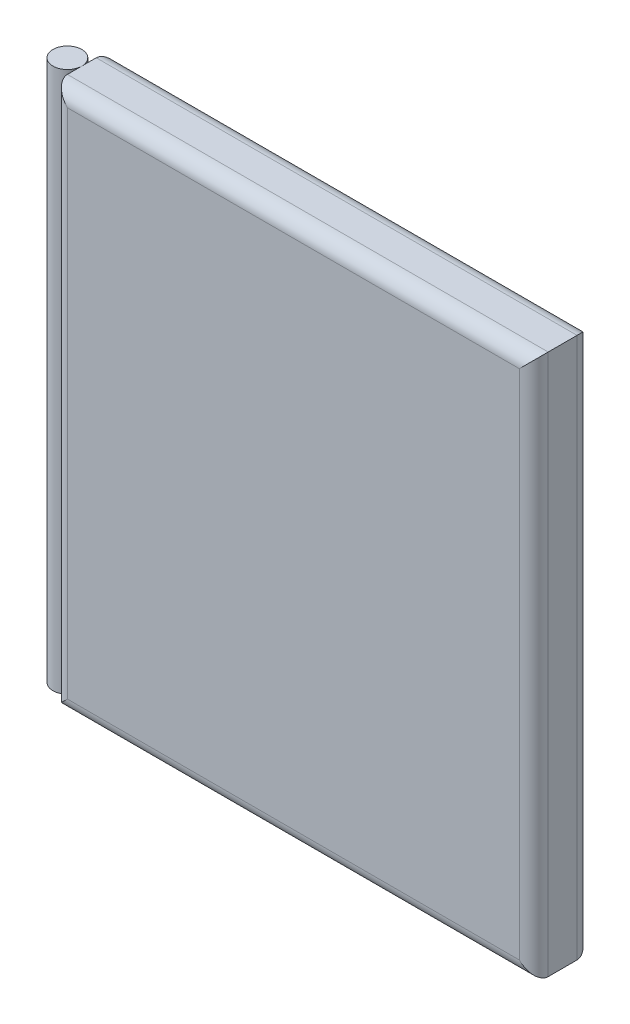
ISO-10303-21;
HEADER;
FILE_DESCRIPTION(('STEP AP214'),'2;1');
FILE_NAME('part.step','',(''),(''),'','','');
FILE_SCHEMA(('AUTOMOTIVE_DESIGN { 1 0 10303 214 1 1 1 1 }'));
ENDSEC;
DATA;
#1=APPLICATION_CONTEXT('core data for automotive mechanical design processes');
#2=APPLICATION_PROTOCOL_DEFINITION('international standard','automotive_design',2000,#1);
#3=PRODUCT_CONTEXT('',#1,'mechanical');
#4=PRODUCT('Part','Part','',(#3));
#5=PRODUCT_RELATED_PRODUCT_CATEGORY('part','',(#4));
#6=PRODUCT_DEFINITION_FORMATION('','',#4);
#7=PRODUCT_DEFINITION_CONTEXT('part definition',#1,'design');
#8=PRODUCT_DEFINITION('design','',#6,#7);
#9=PRODUCT_DEFINITION_SHAPE('','',#8);
#10=(LENGTH_UNIT() NAMED_UNIT(*) SI_UNIT(.MILLI.,.METRE.));
#11=(NAMED_UNIT(*) PLANE_ANGLE_UNIT() SI_UNIT($,.RADIAN.));
#12=(NAMED_UNIT(*) SI_UNIT($,.STERADIAN.) SOLID_ANGLE_UNIT());
#13=UNCERTAINTY_MEASURE_WITH_UNIT(LENGTH_MEASURE(1.E-05),#10,'distance_accuracy_value','');
#14=(GEOMETRIC_REPRESENTATION_CONTEXT(3) GLOBAL_UNCERTAINTY_ASSIGNED_CONTEXT((#13)) GLOBAL_UNIT_ASSIGNED_CONTEXT((#10,
#11,#12)) REPRESENTATION_CONTEXT('',''));
#15=CARTESIAN_POINT('',(0.,0.,0.));
#16=DIRECTION('',(0.,0.,1.));
#17=DIRECTION('',(1.,0.,0.));
#18=AXIS2_PLACEMENT_3D('',#15,#16,#17);
#19=CARTESIAN_POINT('',(-275.994676806084,131.165589353612,40.));
#20=DIRECTION('',(0.,-1.,0.));
#21=DIRECTION('',(0.,0.,-1.));
#22=AXIS2_PLACEMENT_3D('',#19,#20,#21);
#23=CYLINDRICAL_SURFACE('',#22,20.);
#24=CARTESIAN_POINT('',(-275.994676806084,131.165589353612,40.));
#25=DIRECTION('',(0.,-1.,0.));
#26=DIRECTION('',(0.,0.,-1.));
#27=AXIS2_PLACEMENT_3D('',#24,#25,#26);
#28=CIRCLE('',#27,20.);
#29=CARTESIAN_POINT('',(-275.994676806084,131.165589353612,20.));
#30=VERTEX_POINT('',#29);
#31=EDGE_CURVE('E11',#30,#30,#28,.T.);
#32=CARTESIAN_POINT('',(-275.994676806084,-618.834410646388,40.));
#33=DIRECTION('',(0.,-1.,0.));
#34=DIRECTION('',(0.,0.,-1.));
#35=AXIS2_PLACEMENT_3D('',#32,#33,#34);
#36=CIRCLE('',#35,20.);
#37=CARTESIAN_POINT('',(-275.994676806084,-618.834410646388,20.));
#38=VERTEX_POINT('',#37);
#39=EDGE_CURVE('E50',#38,#38,#36,.T.);
#40=CARTESIAN_POINT('',(-275.994676806084,131.165589353612,20.));
#41=CARTESIAN_POINT('',(-275.994676806084,123.353089353612,20.));
#42=CARTESIAN_POINT('',(-275.994676806084,115.540589353612,20.));
#43=CARTESIAN_POINT('',(-275.994676806084,99.9155893536122,20.));
#44=CARTESIAN_POINT('',(-275.994676806084,92.1030893536122,20.));
#45=CARTESIAN_POINT('',(-275.994676806084,76.4780893536122,20.));
#46=CARTESIAN_POINT('',(-275.994676806084,68.6655893536122,20.));
#47=CARTESIAN_POINT('',(-275.994676806084,53.0405893536122,20.));
#48=CARTESIAN_POINT('',(-275.994676806084,45.2280893536122,20.));
#49=CARTESIAN_POINT('',(-275.994676806084,29.6030893536122,20.));
#50=CARTESIAN_POINT('',(-275.994676806084,21.7905893536122,20.));
#51=CARTESIAN_POINT('',(-275.994676806084,6.16558935361222,20.));
#52=CARTESIAN_POINT('',(-275.994676806084,-1.64691064638778,20.));
#53=CARTESIAN_POINT('',(-275.994676806084,-17.2719106463878,20.));
#54=CARTESIAN_POINT('',(-275.994676806084,-25.0844106463878,20.));
#55=CARTESIAN_POINT('',(-275.994676806084,-40.7094106463878,20.));
#56=CARTESIAN_POINT('',(-275.994676806084,-48.5219106463878,20.));
#57=CARTESIAN_POINT('',(-275.994676806084,-64.1469106463878,20.));
#58=CARTESIAN_POINT('',(-275.994676806084,-71.9594106463878,20.));
#59=CARTESIAN_POINT('',(-275.994676806084,-87.5844106463878,20.));
#60=CARTESIAN_POINT('',(-275.994676806084,-95.3969106463878,20.));
#61=CARTESIAN_POINT('',(-275.994676806084,-111.021910646388,20.));
#62=CARTESIAN_POINT('',(-275.994676806084,-118.834410646388,20.));
#63=CARTESIAN_POINT('',(-275.994676806084,-134.459410646388,20.));
#64=CARTESIAN_POINT('',(-275.994676806084,-142.271910646388,20.));
#65=CARTESIAN_POINT('',(-275.994676806084,-157.896910646388,20.));
#66=CARTESIAN_POINT('',(-275.994676806084,-165.709410646388,20.));
#67=CARTESIAN_POINT('',(-275.994676806084,-181.334410646388,20.));
#68=CARTESIAN_POINT('',(-275.994676806084,-189.146910646388,20.));
#69=CARTESIAN_POINT('',(-275.994676806084,-204.771910646388,20.));
#70=CARTESIAN_POINT('',(-275.994676806084,-212.584410646388,20.));
#71=CARTESIAN_POINT('',(-275.994676806084,-228.209410646388,20.));
#72=CARTESIAN_POINT('',(-275.994676806084,-236.021910646388,20.));
#73=CARTESIAN_POINT('',(-275.994676806084,-251.646910646388,20.));
#74=CARTESIAN_POINT('',(-275.994676806084,-259.459410646388,20.));
#75=CARTESIAN_POINT('',(-275.994676806084,-275.084410646388,20.));
#76=CARTESIAN_POINT('',(-275.994676806084,-282.896910646388,20.));
#77=CARTESIAN_POINT('',(-275.994676806084,-298.521910646388,20.));
#78=CARTESIAN_POINT('',(-275.994676806084,-306.334410646388,20.));
#79=CARTESIAN_POINT('',(-275.994676806084,-321.959410646388,20.));
#80=CARTESIAN_POINT('',(-275.994676806084,-329.771910646388,20.));
#81=CARTESIAN_POINT('',(-275.994676806084,-345.396910646388,20.));
#82=CARTESIAN_POINT('',(-275.994676806084,-353.209410646388,20.));
#83=CARTESIAN_POINT('',(-275.994676806084,-368.834410646388,20.));
#84=CARTESIAN_POINT('',(-275.994676806084,-376.646910646388,20.));
#85=CARTESIAN_POINT('',(-275.994676806084,-392.271910646388,20.));
#86=CARTESIAN_POINT('',(-275.994676806084,-400.084410646388,20.));
#87=CARTESIAN_POINT('',(-275.994676806084,-415.709410646388,20.));
#88=CARTESIAN_POINT('',(-275.994676806084,-423.521910646388,20.));
#89=CARTESIAN_POINT('',(-275.994676806084,-439.146910646388,20.));
#90=CARTESIAN_POINT('',(-275.994676806084,-446.959410646388,20.));
#91=CARTESIAN_POINT('',(-275.994676806084,-462.584410646388,20.));
#92=CARTESIAN_POINT('',(-275.994676806084,-470.396910646388,20.));
#93=CARTESIAN_POINT('',(-275.994676806084,-486.021910646388,20.));
#94=CARTESIAN_POINT('',(-275.994676806084,-493.834410646388,20.));
#95=CARTESIAN_POINT('',(-275.994676806084,-509.459410646388,20.));
#96=CARTESIAN_POINT('',(-275.994676806084,-517.271910646388,20.));
#97=CARTESIAN_POINT('',(-275.994676806084,-532.896910646388,20.));
#98=CARTESIAN_POINT('',(-275.994676806084,-540.709410646388,20.));
#99=CARTESIAN_POINT('',(-275.994676806084,-556.334410646388,20.));
#100=CARTESIAN_POINT('',(-275.994676806084,-564.146910646388,20.));
#101=CARTESIAN_POINT('',(-275.994676806084,-579.771910646388,20.));
#102=CARTESIAN_POINT('',(-275.994676806084,-587.584410646388,20.));
#103=CARTESIAN_POINT('',(-275.994676806084,-603.209410646388,20.));
#104=CARTESIAN_POINT('',(-275.994676806084,-611.021910646388,20.));
#105=CARTESIAN_POINT('',(-275.994676806084,-618.834410646388,20.));
#106=B_SPLINE_CURVE_WITH_KNOTS('',3,(#40,#41,#42,#43,#44,#45,#46,#47,#48,#49,#50,#51,#52,#53,
#54,#55,#56,#57,#58,#59,#60,#61,#62,#63,#64,#65,#66,#67,#68,#69,#70,#71,#72,#73,#74,#75,#76,#77,
#78,#79,#80,#81,#82,#83,#84,#85,#86,#87,#88,#89,#90,#91,#92,#93,#94,#95,#96,#97,#98,#99,#100,
#101,#102,#103,#104,#105),.UNSPECIFIED.,.F.,.F.,(4,2,2,2,2,2,2,2,2,2,2,2,2,2,2,2,2,2,2,2,2,2,2,
2,2,2,2,2,2,2,2,2,4),(0.,23.4375,46.875,70.3125,93.75,117.1875,140.625,164.0625,187.5,210.9375,
234.375,257.8125,281.25,304.6875,328.125,351.5625,375.,398.4375,421.875,445.3125,468.75,
492.1875,515.625,539.0625,562.5,585.9375,609.375,632.8125,656.25,679.6875,703.125,726.5625,
750.),.UNSPECIFIED.);
#107=EDGE_CURVE('BSEAM47',#30,#38,#106,.T.);
#108=ORIENTED_EDGE('',*,*,#31,.T.);
#109=ORIENTED_EDGE('',*,*,#39,.F.);
#110=ORIENTED_EDGE('',*,*,#107,.T.);
#111=ORIENTED_EDGE('',*,*,#107,.F.);
#112=EDGE_LOOP('',(#108,#110,#109,#111));
#113=FACE_BOUND('',#112,.T.);
#114=ADVANCED_FACE('F47',(#113),#23,.T.);
#115=CARTESIAN_POINT('',(-275.994676806084,131.165589353612,40.));
#116=DIRECTION('',(0.,-1.,0.));
#117=DIRECTION('',(0.,0.,-1.));
#118=AXIS2_PLACEMENT_3D('',#115,#116,#117);
#119=PLANE('',#118);
#120=ORIENTED_EDGE('',*,*,#31,.F.);
#121=EDGE_LOOP('',(#120));
#122=FACE_BOUND('',#121,.T.);
#123=ADVANCED_FACE('F62',(#122),#119,.F.);
#124=CARTESIAN_POINT('',(-275.994676806084,-618.834410646388,40.));
#125=DIRECTION('',(0.,-1.,0.));
#126=DIRECTION('',(0.,0.,-1.));
#127=AXIS2_PLACEMENT_3D('',#124,#125,#126);
#128=PLANE('',#127);
#129=ORIENTED_EDGE('',*,*,#39,.T.);
#130=EDGE_LOOP('',(#129));
#131=FACE_BOUND('',#130,.T.);
#132=ADVANCED_FACE('F59',(#131),#128,.T.);
#133=CLOSED_SHELL('',(#114,#123,#132));
#134=MANIFOLD_SOLID_BREP('B2',#133);
#135=CARTESIAN_POINT('',(-255.994676806084,131.165589353612,80.));
#136=DIRECTION('',(1.,0.,0.));
#137=DIRECTION('',(0.,1.,0.));
#138=AXIS2_PLACEMENT_3D('',#135,#136,#137);
#139=PLANE('',#138);
#140=DIRECTION('',(0.,0.,-1.));
#141=VECTOR('',#140,1.);
#142=CARTESIAN_POINT('',(-255.994676806084,131.165589353612,80.));
#143=LINE('',#142,#141);
#144=CARTESIAN_POINT('',(-255.994676806084,131.165589353612,60.));
#145=VERTEX_POINT('',#144);
#146=CARTESIAN_POINT('',(-255.994676806084,131.165589353612,20.));
#147=VERTEX_POINT('',#146);
#148=EDGE_CURVE('E173',#145,#147,#143,.T.);
#149=ORIENTED_EDGE('',*,*,#148,.T.);
#150=DIRECTION('',(0.,-1.,0.));
#151=VECTOR('',#150,1.);
#152=CARTESIAN_POINT('',(-255.994676806084,131.165589353612,20.));
#153=LINE('',#152,#151);
#154=CARTESIAN_POINT('',(-255.994676806084,-618.834410646388,20.));
#155=VERTEX_POINT('',#154);
#156=EDGE_CURVE('E187',#147,#155,#153,.T.);
#157=ORIENTED_EDGE('',*,*,#156,.T.);
#158=DIRECTION('',(0.,0.,-1.));
#159=VECTOR('',#158,1.);
#160=CARTESIAN_POINT('',(-255.994676806084,-618.834410646388,80.));
#161=LINE('',#160,#159);
#162=CARTESIAN_POINT('',(-255.994676806084,-618.834410646388,60.));
#163=VERTEX_POINT('',#162);
#164=EDGE_CURVE('E179',#163,#155,#161,.T.);
#165=ORIENTED_EDGE('',*,*,#164,.F.);
#166=DIRECTION('',(0.,-1.,0.));
#167=VECTOR('',#166,1.);
#168=CARTESIAN_POINT('',(-255.994676806084,131.165589353612,60.));
#169=LINE('',#168,#167);
#170=EDGE_CURVE('E190',#163,#145,#169,.F.);
#171=ORIENTED_EDGE('',*,*,#170,.T.);
#172=EDGE_LOOP('',(#149,#157,#165,#171));
#173=FACE_BOUND('',#172,.T.);
#174=ADVANCED_FACE('F88',(#173),#139,.F.);
#175=CARTESIAN_POINT('',(-255.994676806084,-618.834410646388,80.));
#176=DIRECTION('',(0.,1.,0.));
#177=DIRECTION('',(0.,0.,1.));
#178=AXIS2_PLACEMENT_3D('',#175,#176,#177);
#179=PLANE('',#178);
#180=ORIENTED_EDGE('',*,*,#164,.T.);
#181=DIRECTION('',(1.,0.,0.));
#182=VECTOR('',#181,1.);
#183=CARTESIAN_POINT('',(-255.994676806084,-618.834410646388,20.));
#184=LINE('',#183,#182);
#185=CARTESIAN_POINT('',(410.605323193916,-618.834410646388,20.));
#186=VERTEX_POINT('',#185);
#187=EDGE_CURVE('E105',#155,#186,#184,.T.);
#188=ORIENTED_EDGE('',*,*,#187,.T.);
#189=DIRECTION('',(0.,0.,-1.));
#190=VECTOR('',#189,1.);
#191=CARTESIAN_POINT('',(410.605323193916,-618.834410646388,80.));
#192=LINE('',#191,#190);
#193=CARTESIAN_POINT('',(410.605323193916,-618.834410646388,60.));
#194=VERTEX_POINT('',#193);
#195=EDGE_CURVE('E181',#194,#186,#192,.T.);
#196=ORIENTED_EDGE('',*,*,#195,.F.);
#197=DIRECTION('',(1.,0.,0.));
#198=VECTOR('',#197,1.);
#199=CARTESIAN_POINT('',(-255.994676806084,-618.834410646388,60.));
#200=LINE('',#199,#198);
#201=EDGE_CURVE('E205',#194,#163,#200,.F.);
#202=ORIENTED_EDGE('',*,*,#201,.T.);
#203=EDGE_LOOP('',(#180,#188,#196,#202));
#204=FACE_BOUND('',#203,.T.);
#205=ADVANCED_FACE('F252',(#204),#179,.F.);
#206=CARTESIAN_POINT('',(410.605323193916,131.165589353612,80.));
#207=DIRECTION('',(-1.,0.,0.));
#208=DIRECTION('',(0.,-1.,0.));
#209=AXIS2_PLACEMENT_3D('',#206,#207,#208);
#210=PLANE('',#209);
#211=ORIENTED_EDGE('',*,*,#195,.T.);
#212=DIRECTION('',(0.,1.,0.));
#213=VECTOR('',#212,1.);
#214=CARTESIAN_POINT('',(410.605323193916,131.165589353612,20.));
#215=LINE('',#214,#213);
#216=CARTESIAN_POINT('',(410.605323193916,131.165589353612,20.));
#217=VERTEX_POINT('',#216);
#218=EDGE_CURVE('E203',#186,#217,#215,.T.);
#219=ORIENTED_EDGE('',*,*,#218,.T.);
#220=DIRECTION('',(0.,0.,-1.));
#221=VECTOR('',#220,1.);
#222=CARTESIAN_POINT('',(410.605323193916,131.165589353612,80.));
#223=LINE('',#222,#221);
#224=CARTESIAN_POINT('',(410.605323193916,131.165589353612,60.));
#225=VERTEX_POINT('',#224);
#226=EDGE_CURVE('E246',#225,#217,#223,.T.);
#227=ORIENTED_EDGE('',*,*,#226,.F.);
#228=DIRECTION('',(0.,1.,0.));
#229=VECTOR('',#228,1.);
#230=CARTESIAN_POINT('',(410.605323193916,-618.834410646388,60.));
#231=LINE('',#230,#229);
#232=EDGE_CURVE('E112',#225,#194,#231,.F.);
#233=ORIENTED_EDGE('',*,*,#232,.T.);
#234=EDGE_LOOP('',(#211,#219,#227,#233));
#235=FACE_BOUND('',#234,.T.);
#236=ADVANCED_FACE('F251',(#235),#210,.F.);
#237=CARTESIAN_POINT('',(-255.994676806084,131.165589353612,80.));
#238=DIRECTION('',(0.,-1.,0.));
#239=DIRECTION('',(0.,0.,-1.));
#240=AXIS2_PLACEMENT_3D('',#237,#238,#239);
#241=PLANE('',#240);
#242=ORIENTED_EDGE('',*,*,#148,.F.);
#243=DIRECTION('',(-1.,0.,0.));
#244=VECTOR('',#243,1.);
#245=CARTESIAN_POINT('',(410.605323193916,131.165589353612,60.));
#246=LINE('',#245,#244);
#247=EDGE_CURVE('E45',#145,#225,#246,.F.);
#248=ORIENTED_EDGE('',*,*,#247,.T.);
#249=ORIENTED_EDGE('',*,*,#226,.T.);
#250=DIRECTION('',(-1.,0.,0.));
#251=VECTOR('',#250,1.);
#252=CARTESIAN_POINT('',(-255.994676806084,131.165589353612,20.));
#253=LINE('',#252,#251);
#254=EDGE_CURVE('E97',#217,#147,#253,.T.);
#255=ORIENTED_EDGE('',*,*,#254,.T.);
#256=EDGE_LOOP('',(#242,#248,#249,#255));
#257=FACE_BOUND('',#256,.T.);
#258=ADVANCED_FACE('F249',(#257),#241,.F.);
#259=CARTESIAN_POINT('',(0.,0.,80.));
#260=DIRECTION('',(0.,0.,1.));
#261=DIRECTION('',(1.,0.,0.));
#262=AXIS2_PLACEMENT_3D('',#259,#260,#261);
#263=PLANE('',#262);
#264=DIRECTION('',(0.,-1.,0.));
#265=VECTOR('',#264,1.);
#266=CARTESIAN_POINT('',(-235.994676806084,-618.834410646388,80.));
#267=LINE('',#266,#265);
#268=CARTESIAN_POINT('',(-235.994676806084,111.165589353612,80.));
#269=VERTEX_POINT('',#268);
#270=CARTESIAN_POINT('',(-235.994676806084,-598.834410646388,80.));
#271=VERTEX_POINT('',#270);
#272=EDGE_CURVE('E166',#269,#271,#267,.T.);
#273=ORIENTED_EDGE('',*,*,#272,.T.);
#274=DIRECTION('',(1.,0.,0.));
#275=VECTOR('',#274,1.);
#276=CARTESIAN_POINT('',(410.605323193916,-598.834410646388,80.));
#277=LINE('',#276,#275);
#278=CARTESIAN_POINT('',(390.605323193916,-598.834410646388,80.));
#279=VERTEX_POINT('',#278);
#280=EDGE_CURVE('E162',#271,#279,#277,.T.);
#281=ORIENTED_EDGE('',*,*,#280,.T.);
#282=DIRECTION('',(0.,1.,0.));
#283=VECTOR('',#282,1.);
#284=CARTESIAN_POINT('',(390.605323193916,131.165589353612,80.));
#285=LINE('',#284,#283);
#286=CARTESIAN_POINT('',(390.605323193916,111.165589353612,80.));
#287=VERTEX_POINT('',#286);
#288=EDGE_CURVE('E154',#279,#287,#285,.T.);
#289=ORIENTED_EDGE('',*,*,#288,.T.);
#290=DIRECTION('',(-1.,0.,0.));
#291=VECTOR('',#290,1.);
#292=CARTESIAN_POINT('',(-255.994676806084,111.165589353612,80.));
#293=LINE('',#292,#291);
#294=EDGE_CURVE('E159',#287,#269,#293,.T.);
#295=ORIENTED_EDGE('',*,*,#294,.T.);
#296=EDGE_LOOP('',(#273,#281,#289,#295));
#297=FACE_BOUND('',#296,.T.);
#298=ADVANCED_FACE('F157',(#297),#263,.T.);
#299=CARTESIAN_POINT('',(0.,0.,0.));
#300=DIRECTION('',(0.,0.,1.));
#301=DIRECTION('',(1.,0.,0.));
#302=AXIS2_PLACEMENT_3D('',#299,#300,#301);
#303=PLANE('',#302);
#304=DIRECTION('',(0.,1.,0.));
#305=VECTOR('',#304,1.);
#306=CARTESIAN_POINT('',(390.605323193916,0.,0.));
#307=LINE('',#306,#305);
#308=CARTESIAN_POINT('',(390.605323193916,111.165589353612,0.));
#309=VERTEX_POINT('',#308);
#310=CARTESIAN_POINT('',(390.605323193916,-598.834410646388,0.));
#311=VERTEX_POINT('',#310);
#312=EDGE_CURVE('E195',#309,#311,#307,.F.);
#313=ORIENTED_EDGE('',*,*,#312,.T.);
#314=DIRECTION('',(1.,0.,0.));
#315=VECTOR('',#314,1.);
#316=CARTESIAN_POINT('',(0.,-598.834410646388,0.));
#317=LINE('',#316,#315);
#318=CARTESIAN_POINT('',(-235.994676806084,-598.834410646388,0.));
#319=VERTEX_POINT('',#318);
#320=EDGE_CURVE('E200',#311,#319,#317,.F.);
#321=ORIENTED_EDGE('',*,*,#320,.T.);
#322=DIRECTION('',(0.,-1.,0.));
#323=VECTOR('',#322,1.);
#324=CARTESIAN_POINT('',(-235.994676806084,0.,0.));
#325=LINE('',#324,#323);
#326=CARTESIAN_POINT('',(-235.994676806084,111.165589353612,0.));
#327=VERTEX_POINT('',#326);
#328=EDGE_CURVE('E197',#319,#327,#325,.F.);
#329=ORIENTED_EDGE('',*,*,#328,.T.);
#330=DIRECTION('',(-1.,0.,0.));
#331=VECTOR('',#330,1.);
#332=CARTESIAN_POINT('',(0.,111.165589353612,0.));
#333=LINE('',#332,#331);
#334=EDGE_CURVE('E193',#327,#309,#333,.F.);
#335=ORIENTED_EDGE('',*,*,#334,.T.);
#336=EDGE_LOOP('',(#313,#321,#329,#335));
#337=FACE_BOUND('',#336,.T.);
#338=ADVANCED_FACE('F234',(#337),#303,.F.);
#339=CARTESIAN_POINT('',(390.605323193916,0.,60.));
#340=DIRECTION('',(0.,-1.,0.));
#341=DIRECTION('',(1.,0.,0.));
#342=AXIS2_PLACEMENT_3D('',#339,#340,#341);
#343=CYLINDRICAL_SURFACE('',#342,20.);
#344=CARTESIAN_POINT('',(390.605323193916,-598.834410646388,60.));
#345=DIRECTION('',(-0.707106781186547,-0.707106781186548,0.));
#346=DIRECTION('',(-0.707106781186548,0.707106781186547,0.));
#347=AXIS2_PLACEMENT_3D('',#344,#345,#346);
#348=ELLIPSE('',#347,28.2842712474619,20.);
#349=EDGE_CURVE('E174',#194,#279,#348,.T.);
#350=ORIENTED_EDGE('',*,*,#349,.F.);
#351=ORIENTED_EDGE('',*,*,#232,.F.);
#352=CARTESIAN_POINT('',(390.605323193916,111.165589353612,60.));
#353=DIRECTION('',(0.707106781186548,-0.707106781186547,0.));
#354=DIRECTION('',(0.707106781186547,0.707106781186548,0.));
#355=AXIS2_PLACEMENT_3D('',#352,#353,#354);
#356=ELLIPSE('',#355,28.2842712474619,20.);
#357=EDGE_CURVE('E169',#287,#225,#356,.F.);
#358=ORIENTED_EDGE('',*,*,#357,.F.);
#359=ORIENTED_EDGE('',*,*,#288,.F.);
#360=EDGE_LOOP('',(#350,#351,#358,#359));
#361=FACE_BOUND('',#360,.T.);
#362=ADVANCED_FACE('F170',(#361),#343,.T.);
#363=CARTESIAN_POINT('',(0.,111.165589353612,60.));
#364=DIRECTION('',(1.,0.,0.));
#365=DIRECTION('',(0.,0.,-1.));
#366=AXIS2_PLACEMENT_3D('',#363,#364,#365);
#367=CYLINDRICAL_SURFACE('',#366,20.);
#368=ORIENTED_EDGE('',*,*,#357,.T.);
#369=ORIENTED_EDGE('',*,*,#247,.F.);
#370=CARTESIAN_POINT('',(-235.994676806084,111.165589353612,60.));
#371=DIRECTION('',(0.707106781186547,0.707106781186548,0.));
#372=DIRECTION('',(0.707106781186547,-0.707106781186547,0.));
#373=AXIS2_PLACEMENT_3D('',#370,#371,#372);
#374=ELLIPSE('',#373,28.2842712474619,20.);
#375=EDGE_CURVE('E177',#269,#145,#374,.F.);
#376=ORIENTED_EDGE('',*,*,#375,.F.);
#377=ORIENTED_EDGE('',*,*,#294,.F.);
#378=EDGE_LOOP('',(#368,#369,#376,#377));
#379=FACE_BOUND('',#378,.T.);
#380=ADVANCED_FACE('F176',(#379),#367,.T.);
#381=CARTESIAN_POINT('',(0.,-598.834410646388,60.));
#382=DIRECTION('',(-1.,0.,0.));
#383=DIRECTION('',(0.,0.,1.));
#384=AXIS2_PLACEMENT_3D('',#381,#382,#383);
#385=CYLINDRICAL_SURFACE('',#384,20.);
#386=ORIENTED_EDGE('',*,*,#349,.T.);
#387=ORIENTED_EDGE('',*,*,#280,.F.);
#388=CARTESIAN_POINT('',(-235.994676806084,-598.834410646388,60.));
#389=DIRECTION('',(-0.707106781186547,0.707106781186547,0.));
#390=DIRECTION('',(-0.707106781186547,-0.707106781186548,0.));
#391=AXIS2_PLACEMENT_3D('',#388,#389,#390);
#392=ELLIPSE('',#391,28.2842712474619,20.);
#393=EDGE_CURVE('E210',#163,#271,#392,.T.);
#394=ORIENTED_EDGE('',*,*,#393,.F.);
#395=ORIENTED_EDGE('',*,*,#201,.F.);
#396=EDGE_LOOP('',(#386,#387,#394,#395));
#397=FACE_BOUND('',#396,.T.);
#398=ADVANCED_FACE('F256',(#397),#385,.T.);
#399=CARTESIAN_POINT('',(-235.994676806084,0.,60.));
#400=DIRECTION('',(0.,1.,0.));
#401=DIRECTION('',(-1.,0.,0.));
#402=AXIS2_PLACEMENT_3D('',#399,#400,#401);
#403=CYLINDRICAL_SURFACE('',#402,20.);
#404=ORIENTED_EDGE('',*,*,#375,.T.);
#405=ORIENTED_EDGE('',*,*,#170,.F.);
#406=ORIENTED_EDGE('',*,*,#393,.T.);
#407=ORIENTED_EDGE('',*,*,#272,.F.);
#408=EDGE_LOOP('',(#404,#405,#406,#407));
#409=FACE_BOUND('',#408,.T.);
#410=ADVANCED_FACE('F258',(#409),#403,.T.);
#411=CARTESIAN_POINT('',(390.605323193916,131.165589353612,20.));
#412=DIRECTION('',(0.,1.,0.));
#413=DIRECTION('',(-1.,0.,0.));
#414=AXIS2_PLACEMENT_3D('',#411,#412,#413);
#415=CYLINDRICAL_SURFACE('',#414,20.);
#416=CARTESIAN_POINT('',(390.605323193916,-598.834410646388,20.));
#417=DIRECTION('',(0.707106781186547,0.707106781186548,0.));
#418=DIRECTION('',(0.707106781186548,-0.707106781186547,0.));
#419=AXIS2_PLACEMENT_3D('',#416,#417,#418);
#420=ELLIPSE('',#419,28.2842712474619,20.);
#421=EDGE_CURVE('E218',#311,#186,#420,.F.);
#422=ORIENTED_EDGE('',*,*,#421,.F.);
#423=ORIENTED_EDGE('',*,*,#312,.F.);
#424=CARTESIAN_POINT('',(390.605323193916,111.165589353612,20.));
#425=DIRECTION('',(-0.707106781186548,0.707106781186547,0.));
#426=DIRECTION('',(-0.707106781186547,-0.707106781186548,0.));
#427=AXIS2_PLACEMENT_3D('',#424,#425,#426);
#428=ELLIPSE('',#427,28.2842712474619,20.);
#429=EDGE_CURVE('E92',#217,#309,#428,.T.);
#430=ORIENTED_EDGE('',*,*,#429,.F.);
#431=ORIENTED_EDGE('',*,*,#218,.F.);
#432=EDGE_LOOP('',(#422,#423,#430,#431));
#433=FACE_BOUND('',#432,.T.);
#434=ADVANCED_FACE('F90',(#433),#415,.T.);
#435=CARTESIAN_POINT('',(-255.994676806084,111.165589353612,20.));
#436=DIRECTION('',(-1.,0.,0.));
#437=DIRECTION('',(0.,0.,1.));
#438=AXIS2_PLACEMENT_3D('',#435,#436,#437);
#439=CYLINDRICAL_SURFACE('',#438,20.);
#440=ORIENTED_EDGE('',*,*,#429,.T.);
#441=ORIENTED_EDGE('',*,*,#334,.F.);
#442=CARTESIAN_POINT('',(-235.994676806084,111.165589353612,20.));
#443=DIRECTION('',(-0.707106781186547,-0.707106781186548,0.));
#444=DIRECTION('',(-0.707106781186547,0.707106781186547,0.));
#445=AXIS2_PLACEMENT_3D('',#442,#443,#444);
#446=ELLIPSE('',#445,28.2842712474619,20.);
#447=EDGE_CURVE('E217',#147,#327,#446,.T.);
#448=ORIENTED_EDGE('',*,*,#447,.F.);
#449=ORIENTED_EDGE('',*,*,#254,.F.);
#450=EDGE_LOOP('',(#440,#441,#448,#449));
#451=FACE_BOUND('',#450,.T.);
#452=ADVANCED_FACE('F228',(#451),#439,.T.);
#453=CARTESIAN_POINT('',(-255.994676806084,-598.834410646388,20.));
#454=DIRECTION('',(1.,0.,0.));
#455=DIRECTION('',(0.,0.,-1.));
#456=AXIS2_PLACEMENT_3D('',#453,#454,#455);
#457=CYLINDRICAL_SURFACE('',#456,20.);
#458=ORIENTED_EDGE('',*,*,#421,.T.);
#459=ORIENTED_EDGE('',*,*,#187,.F.);
#460=CARTESIAN_POINT('',(-235.994676806084,-598.834410646388,20.));
#461=DIRECTION('',(0.707106781186547,-0.707106781186547,0.));
#462=DIRECTION('',(0.707106781186547,0.707106781186548,0.));
#463=AXIS2_PLACEMENT_3D('',#460,#461,#462);
#464=ELLIPSE('',#463,28.2842712474619,20.);
#465=EDGE_CURVE('E214',#319,#155,#464,.F.);
#466=ORIENTED_EDGE('',*,*,#465,.F.);
#467=ORIENTED_EDGE('',*,*,#320,.F.);
#468=EDGE_LOOP('',(#458,#459,#466,#467));
#469=FACE_BOUND('',#468,.T.);
#470=ADVANCED_FACE('F240',(#469),#457,.T.);
#471=CARTESIAN_POINT('',(-235.994676806084,131.165589353612,20.));
#472=DIRECTION('',(0.,-1.,0.));
#473=DIRECTION('',(1.,0.,0.));
#474=AXIS2_PLACEMENT_3D('',#471,#472,#473);
#475=CYLINDRICAL_SURFACE('',#474,20.);
#476=ORIENTED_EDGE('',*,*,#447,.T.);
#477=ORIENTED_EDGE('',*,*,#328,.F.);
#478=ORIENTED_EDGE('',*,*,#465,.T.);
#479=ORIENTED_EDGE('',*,*,#156,.F.);
#480=EDGE_LOOP('',(#476,#477,#478,#479));
#481=FACE_BOUND('',#480,.T.);
#482=ADVANCED_FACE('F238',(#481),#475,.T.);
#483=CLOSED_SHELL('',(#174,#205,#236,#258,#298,#338,#362,#380,#398,#410,#434,#452,#470,#482));
#484=MANIFOLD_SOLID_BREP('B6',#483);
#485=ADVANCED_BREP_SHAPE_REPRESENTATION('',(#18,#134,#484),#14);
#486=SHAPE_DEFINITION_REPRESENTATION(#9,#485);
ENDSEC;
END-ISO-10303-21;
